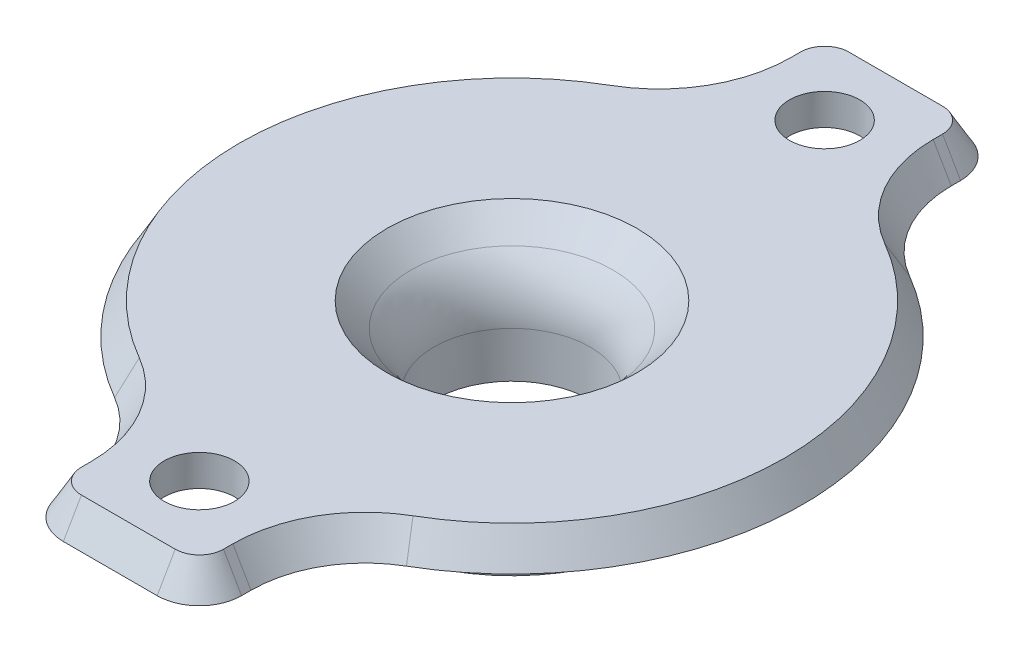
ISO-10303-21;
HEADER;
FILE_DESCRIPTION(('STEP AP214'),'2;1');
FILE_NAME('part.step','',(''),(''),'','','');
FILE_SCHEMA(('AUTOMOTIVE_DESIGN { 1 0 10303 214 1 1 1 1 }'));
ENDSEC;
DATA;
#1=APPLICATION_CONTEXT('core data for automotive mechanical design processes');
#2=APPLICATION_PROTOCOL_DEFINITION('international standard','automotive_design',2000,#1);
#3=PRODUCT_CONTEXT('',#1,'mechanical');
#4=PRODUCT('Part','Part','',(#3));
#5=PRODUCT_RELATED_PRODUCT_CATEGORY('part','',(#4));
#6=PRODUCT_DEFINITION_FORMATION('','',#4);
#7=PRODUCT_DEFINITION_CONTEXT('part definition',#1,'design');
#8=PRODUCT_DEFINITION('design','',#6,#7);
#9=PRODUCT_DEFINITION_SHAPE('','',#8);
#10=(LENGTH_UNIT() NAMED_UNIT(*) SI_UNIT(.MILLI.,.METRE.));
#11=(NAMED_UNIT(*) PLANE_ANGLE_UNIT() SI_UNIT($,.RADIAN.));
#12=(NAMED_UNIT(*) SI_UNIT($,.STERADIAN.) SOLID_ANGLE_UNIT());
#13=UNCERTAINTY_MEASURE_WITH_UNIT(LENGTH_MEASURE(1.E-05),#10,'distance_accuracy_value','');
#14=(GEOMETRIC_REPRESENTATION_CONTEXT(3) GLOBAL_UNCERTAINTY_ASSIGNED_CONTEXT((#13)) GLOBAL_UNIT_ASSIGNED_CONTEXT((#10,
#11,#12)) REPRESENTATION_CONTEXT('',''));
#15=CARTESIAN_POINT('',(0.,0.,0.));
#16=DIRECTION('',(0.,0.,1.));
#17=DIRECTION('',(1.,0.,0.));
#18=AXIS2_PLACEMENT_3D('',#15,#16,#17);
#19=CARTESIAN_POINT('',(-5.,2.,0.));
#20=DIRECTION('',(0.,1.,0.));
#21=DIRECTION('',(0.,0.,1.));
#22=AXIS2_PLACEMENT_3D('',#19,#20,#21);
#23=PLANE('',#22);
#24=CARTESIAN_POINT('',(0.,2.,0.));
#25=DIRECTION('',(0.,1.,0.));
#26=DIRECTION('',(0.,0.,1.));
#27=AXIS2_PLACEMENT_3D('',#24,#25,#26);
#28=CIRCLE('',#27,8.00000000000003);
#29=CARTESIAN_POINT('',(0.,2.,8.00000000000003));
#30=VERTEX_POINT('',#29);
#31=EDGE_CURVE('E235',#30,#30,#28,.F.);
#32=ORIENTED_EDGE('',*,*,#31,.T.);
#33=EDGE_LOOP('',(#32));
#34=FACE_BOUND('',#33,.T.);
#35=CARTESIAN_POINT('',(-3.,2.,23.));
#36=DIRECTION('',(0.,1.,0.));
#37=DIRECTION('',(0.,0.,1.));
#38=AXIS2_PLACEMENT_3D('',#35,#36,#37);
#39=CIRCLE('',#38,1.54529946162075);
#40=CARTESIAN_POINT('',(-4.54529946162075,2.,23.));
#41=VERTEX_POINT('',#40);
#42=CARTESIAN_POINT('',(-3.,2.,24.5452994616207));
#43=VERTEX_POINT('',#42);
#44=EDGE_CURVE('E67',#41,#43,#39,.T.);
#45=ORIENTED_EDGE('',*,*,#44,.T.);
#46=DIRECTION('',(1.,0.,0.));
#47=VECTOR('',#46,1.);
#48=CARTESIAN_POINT('',(-5.,2.,24.5452994616207));
#49=LINE('',#48,#47);
#50=CARTESIAN_POINT('',(3.,2.,24.5452994616207));
#51=VERTEX_POINT('',#50);
#52=EDGE_CURVE('E229',#43,#51,#49,.T.);
#53=ORIENTED_EDGE('',*,*,#52,.T.);
#54=CARTESIAN_POINT('',(3.,2.,23.));
#55=DIRECTION('',(0.,1.,0.));
#56=DIRECTION('',(0.,0.,1.));
#57=AXIS2_PLACEMENT_3D('',#54,#55,#56);
#58=CIRCLE('',#57,1.54529946162075);
#59=CARTESIAN_POINT('',(4.54529946162075,2.,23.));
#60=VERTEX_POINT('',#59);
#61=EDGE_CURVE('E226',#51,#60,#58,.T.);
#62=ORIENTED_EDGE('',*,*,#61,.T.);
#63=DIRECTION('',(0.,0.,-1.));
#64=VECTOR('',#63,1.);
#65=CARTESIAN_POINT('',(4.54529946162075,2.,22.401116043626));
#66=LINE('',#65,#64);
#67=CARTESIAN_POINT('',(4.54529946162075,2.,22.401116043626));
#68=VERTEX_POINT('',#67);
#69=EDGE_CURVE('E221',#60,#68,#66,.T.);
#70=ORIENTED_EDGE('',*,*,#69,.T.);
#71=CARTESIAN_POINT('',(13.,2.,22.401116043626));
#72=DIRECTION('',(0.,1.,0.));
#73=DIRECTION('',(0.,0.,1.));
#74=AXIS2_PLACEMENT_3D('',#71,#72,#73);
#75=CIRCLE('',#74,8.45470053837925);
#76=CARTESIAN_POINT('',(8.75632791509922,2.,15.08857828786));
#77=VERTEX_POINT('',#76);
#78=EDGE_CURVE('E222',#68,#77,#75,.F.);
#79=ORIENTED_EDGE('',*,*,#78,.T.);
#80=CARTESIAN_POINT('',(0.,2.,0.));
#81=DIRECTION('',(0.,1.,0.));
#82=DIRECTION('',(0.,0.,1.));
#83=AXIS2_PLACEMENT_3D('',#80,#81,#82);
#84=CIRCLE('',#83,17.4452994616207);
#85=CARTESIAN_POINT('',(8.75632791509922,2.,-15.08857828786));
#86=VERTEX_POINT('',#85);
#87=EDGE_CURVE('E178',#77,#86,#84,.T.);
#88=ORIENTED_EDGE('',*,*,#87,.T.);
#89=CARTESIAN_POINT('',(13.,2.,-22.401116043626));
#90=DIRECTION('',(0.,1.,0.));
#91=DIRECTION('',(0.,0.,1.));
#92=AXIS2_PLACEMENT_3D('',#89,#90,#91);
#93=CIRCLE('',#92,8.45470053837925);
#94=CARTESIAN_POINT('',(4.54529946162075,2.,-22.401116043626));
#95=VERTEX_POINT('',#94);
#96=EDGE_CURVE('E213',#86,#95,#93,.F.);
#97=ORIENTED_EDGE('',*,*,#96,.T.);
#98=DIRECTION('',(0.,0.,-1.));
#99=VECTOR('',#98,1.);
#100=CARTESIAN_POINT('',(4.54529946162075,2.,0.));
#101=LINE('',#100,#99);
#102=CARTESIAN_POINT('',(4.54529946162075,2.,-23.));
#103=VERTEX_POINT('',#102);
#104=EDGE_CURVE('E208',#95,#103,#101,.T.);
#105=ORIENTED_EDGE('',*,*,#104,.T.);
#106=CARTESIAN_POINT('',(3.,2.,-23.));
#107=DIRECTION('',(0.,1.,0.));
#108=DIRECTION('',(0.,0.,1.));
#109=AXIS2_PLACEMENT_3D('',#106,#107,#108);
#110=CIRCLE('',#109,1.54529946162075);
#111=CARTESIAN_POINT('',(3.,2.,-24.5452994616207));
#112=VERTEX_POINT('',#111);
#113=EDGE_CURVE('E207',#103,#112,#110,.T.);
#114=ORIENTED_EDGE('',*,*,#113,.T.);
#115=DIRECTION('',(-1.,0.,0.));
#116=VECTOR('',#115,1.);
#117=CARTESIAN_POINT('',(-5.,2.,-24.5452994616207));
#118=LINE('',#117,#116);
#119=CARTESIAN_POINT('',(-3.,2.,-24.5452994616207));
#120=VERTEX_POINT('',#119);
#121=EDGE_CURVE('E205',#112,#120,#118,.T.);
#122=ORIENTED_EDGE('',*,*,#121,.T.);
#123=CARTESIAN_POINT('',(-3.,2.,-23.));
#124=DIRECTION('',(0.,1.,0.));
#125=DIRECTION('',(0.,0.,1.));
#126=AXIS2_PLACEMENT_3D('',#123,#124,#125);
#127=CIRCLE('',#126,1.54529946162075);
#128=CARTESIAN_POINT('',(-4.54529946162075,2.,-23.));
#129=VERTEX_POINT('',#128);
#130=EDGE_CURVE('E204',#120,#129,#127,.T.);
#131=ORIENTED_EDGE('',*,*,#130,.T.);
#132=DIRECTION('',(0.,0.,1.));
#133=VECTOR('',#132,1.);
#134=CARTESIAN_POINT('',(-4.54529946162075,2.,-22.401116043626));
#135=LINE('',#134,#133);
#136=CARTESIAN_POINT('',(-4.54529946162075,2.,-22.401116043626));
#137=VERTEX_POINT('',#136);
#138=EDGE_CURVE('E206',#129,#137,#135,.T.);
#139=ORIENTED_EDGE('',*,*,#138,.T.);
#140=CARTESIAN_POINT('',(-13.,2.,-22.401116043626));
#141=DIRECTION('',(0.,1.,0.));
#142=DIRECTION('',(0.,0.,1.));
#143=AXIS2_PLACEMENT_3D('',#140,#141,#142);
#144=CIRCLE('',#143,8.45470053837925);
#145=CARTESIAN_POINT('',(-8.75632791509922,2.,-15.08857828786));
#146=VERTEX_POINT('',#145);
#147=EDGE_CURVE('E215',#137,#146,#144,.F.);
#148=ORIENTED_EDGE('',*,*,#147,.T.);
#149=CARTESIAN_POINT('',(0.,2.,0.));
#150=DIRECTION('',(0.,1.,0.));
#151=DIRECTION('',(0.,0.,1.));
#152=AXIS2_PLACEMENT_3D('',#149,#150,#151);
#153=CIRCLE('',#152,17.4452994616207);
#154=CARTESIAN_POINT('',(-8.75632791509922,2.,15.08857828786));
#155=VERTEX_POINT('',#154);
#156=EDGE_CURVE('E216',#146,#155,#153,.T.);
#157=ORIENTED_EDGE('',*,*,#156,.T.);
#158=CARTESIAN_POINT('',(-13.,2.,22.401116043626));
#159=DIRECTION('',(0.,1.,0.));
#160=DIRECTION('',(0.,0.,1.));
#161=AXIS2_PLACEMENT_3D('',#158,#159,#160);
#162=CIRCLE('',#161,8.45470053837925);
#163=CARTESIAN_POINT('',(-4.54529946162075,2.,22.401116043626));
#164=VERTEX_POINT('',#163);
#165=EDGE_CURVE('E218',#155,#164,#162,.F.);
#166=ORIENTED_EDGE('',*,*,#165,.T.);
#167=DIRECTION('',(0.,0.,1.));
#168=VECTOR('',#167,1.);
#169=CARTESIAN_POINT('',(-4.54529946162075,2.,0.));
#170=LINE('',#169,#168);
#171=EDGE_CURVE('E223',#164,#41,#170,.T.);
#172=ORIENTED_EDGE('',*,*,#171,.T.);
#173=EDGE_LOOP('',(#45,#53,#62,#70,#79,#88,#97,#105,#114,#122,#131,#139,#148,#157,#166,#172));
#174=FACE_BOUND('',#173,.T.);
#175=CARTESIAN_POINT('',(0.,2.,-20.));
#176=DIRECTION('',(0.,1.,0.));
#177=DIRECTION('',(0.,0.,1.));
#178=AXIS2_PLACEMENT_3D('',#175,#176,#177);
#179=CIRCLE('',#178,2.25);
#180=CARTESIAN_POINT('',(0.,2.,-17.75));
#181=VERTEX_POINT('',#180);
#182=EDGE_CURVE('E463',#181,#181,#179,.T.);
#183=ORIENTED_EDGE('',*,*,#182,.F.);
#184=EDGE_LOOP('',(#183));
#185=FACE_BOUND('',#184,.T.);
#186=CARTESIAN_POINT('',(0.,2.,20.));
#187=DIRECTION('',(0.,1.,0.));
#188=DIRECTION('',(0.,0.,1.));
#189=AXIS2_PLACEMENT_3D('',#186,#187,#188);
#190=CIRCLE('',#189,2.25);
#191=CARTESIAN_POINT('',(0.,2.,22.25));
#192=VERTEX_POINT('',#191);
#193=EDGE_CURVE('E472',#192,#192,#190,.F.);
#194=ORIENTED_EDGE('',*,*,#193,.T.);
#195=EDGE_LOOP('',(#194));
#196=FACE_BOUND('',#195,.T.);
#197=ADVANCED_FACE('F42',(#34,#174,#185,#196),#23,.T.);
#198=CARTESIAN_POINT('',(-18.6,0.,0.));
#199=DIRECTION('',(0.,-1.,0.));
#200=DIRECTION('',(0.,0.,-1.));
#201=AXIS2_PLACEMENT_3D('',#198,#199,#200);
#202=PLANE('',#201);
#203=CARTESIAN_POINT('',(0.,0.,0.));
#204=DIRECTION('',(0.,-1.,0.));
#205=DIRECTION('',(0.,0.,-1.));
#206=AXIS2_PLACEMENT_3D('',#203,#204,#205);
#207=CIRCLE('',#206,12.25);
#208=CARTESIAN_POINT('',(0.,0.,-12.25));
#209=VERTEX_POINT('',#208);
#210=EDGE_CURVE('E52',#209,#209,#207,.F.);
#211=ORIENTED_EDGE('',*,*,#210,.T.);
#212=EDGE_LOOP('',(#211));
#213=FACE_BOUND('',#212,.T.);
#214=CARTESIAN_POINT('',(0.,0.,20.));
#215=DIRECTION('',(0.,-1.,0.));
#216=DIRECTION('',(0.,0.,-1.));
#217=AXIS2_PLACEMENT_3D('',#214,#215,#216);
#218=CIRCLE('',#217,2.25);
#219=CARTESIAN_POINT('',(0.,0.,17.75));
#220=VERTEX_POINT('',#219);
#221=EDGE_CURVE('E476',#220,#220,#218,.T.);
#222=ORIENTED_EDGE('',*,*,#221,.F.);
#223=EDGE_LOOP('',(#222));
#224=FACE_BOUND('',#223,.T.);
#225=DIRECTION('',(0.,0.,-1.));
#226=VECTOR('',#225,1.);
#227=CARTESIAN_POINT('',(-5.7,0.,0.));
#228=LINE('',#227,#226);
#229=CARTESIAN_POINT('',(-5.7,0.,-22.401116043626));
#230=VERTEX_POINT('',#229);
#231=CARTESIAN_POINT('',(-5.7,0.,-23.));
#232=VERTEX_POINT('',#231);
#233=EDGE_CURVE('E433',#230,#232,#228,.T.);
#234=ORIENTED_EDGE('',*,*,#233,.T.);
#235=CARTESIAN_POINT('',(-3.,0.,-23.));
#236=DIRECTION('',(0.,-1.,0.));
#237=DIRECTION('',(0.,0.,-1.));
#238=AXIS2_PLACEMENT_3D('',#235,#236,#237);
#239=CIRCLE('',#238,2.7);
#240=CARTESIAN_POINT('',(-3.,0.,-25.7));
#241=VERTEX_POINT('',#240);
#242=EDGE_CURVE('E199',#232,#241,#239,.T.);
#243=ORIENTED_EDGE('',*,*,#242,.T.);
#244=DIRECTION('',(-1.,0.,0.));
#245=VECTOR('',#244,1.);
#246=CARTESIAN_POINT('',(0.,0.,-25.7));
#247=LINE('',#246,#245);
#248=CARTESIAN_POINT('',(3.,0.,-25.7));
#249=VERTEX_POINT('',#248);
#250=EDGE_CURVE('E458',#249,#241,#247,.T.);
#251=ORIENTED_EDGE('',*,*,#250,.F.);
#252=CARTESIAN_POINT('',(3.,0.,-23.));
#253=DIRECTION('',(0.,-1.,0.));
#254=DIRECTION('',(0.,0.,-1.));
#255=AXIS2_PLACEMENT_3D('',#252,#253,#254);
#256=CIRCLE('',#255,2.7);
#257=CARTESIAN_POINT('',(5.7,0.,-23.));
#258=VERTEX_POINT('',#257);
#259=EDGE_CURVE('E197',#249,#258,#256,.T.);
#260=ORIENTED_EDGE('',*,*,#259,.T.);
#261=DIRECTION('',(0.,0.,-1.));
#262=VECTOR('',#261,1.);
#263=CARTESIAN_POINT('',(5.7,0.,0.));
#264=LINE('',#263,#262);
#265=CARTESIAN_POINT('',(5.7,0.,-22.401116043626));
#266=VERTEX_POINT('',#265);
#267=EDGE_CURVE('E465',#266,#258,#264,.T.);
#268=ORIENTED_EDGE('',*,*,#267,.F.);
#269=CARTESIAN_POINT('',(13.,0.,-22.401116043626));
#270=DIRECTION('',(0.,-1.,0.));
#271=DIRECTION('',(0.,0.,-1.));
#272=AXIS2_PLACEMENT_3D('',#269,#270,#271);
#273=CIRCLE('',#272,7.3);
#274=CARTESIAN_POINT('',(9.33590733590734,0.,-16.0872879695538));
#275=VERTEX_POINT('',#274);
#276=EDGE_CURVE('E166',#266,#275,#273,.F.);
#277=ORIENTED_EDGE('',*,*,#276,.T.);
#278=CARTESIAN_POINT('',(0.,0.,0.));
#279=DIRECTION('',(0.,1.,0.));
#280=DIRECTION('',(0.,0.,1.));
#281=AXIS2_PLACEMENT_3D('',#278,#279,#280);
#282=CIRCLE('',#281,18.6);
#283=CARTESIAN_POINT('',(9.33590733590734,0.,16.0872879695538));
#284=VERTEX_POINT('',#283);
#285=EDGE_CURVE('E156',#284,#275,#282,.T.);
#286=ORIENTED_EDGE('',*,*,#285,.F.);
#287=CARTESIAN_POINT('',(13.,0.,22.401116043626));
#288=DIRECTION('',(0.,-1.,0.));
#289=DIRECTION('',(0.,0.,-1.));
#290=AXIS2_PLACEMENT_3D('',#287,#288,#289);
#291=CIRCLE('',#290,7.3);
#292=CARTESIAN_POINT('',(5.7,0.,22.401116043626));
#293=VERTEX_POINT('',#292);
#294=EDGE_CURVE('E164',#284,#293,#291,.F.);
#295=ORIENTED_EDGE('',*,*,#294,.T.);
#296=DIRECTION('',(0.,0.,1.));
#297=VECTOR('',#296,1.);
#298=CARTESIAN_POINT('',(5.7,0.,0.));
#299=LINE('',#298,#297);
#300=CARTESIAN_POINT('',(5.7,0.,23.));
#301=VERTEX_POINT('',#300);
#302=EDGE_CURVE('E266',#293,#301,#299,.T.);
#303=ORIENTED_EDGE('',*,*,#302,.T.);
#304=CARTESIAN_POINT('',(3.,0.,23.));
#305=DIRECTION('',(0.,-1.,0.));
#306=DIRECTION('',(0.,0.,-1.));
#307=AXIS2_PLACEMENT_3D('',#304,#305,#306);
#308=CIRCLE('',#307,2.7);
#309=CARTESIAN_POINT('',(3.,0.,25.7));
#310=VERTEX_POINT('',#309);
#311=EDGE_CURVE('E189',#301,#310,#308,.T.);
#312=ORIENTED_EDGE('',*,*,#311,.T.);
#313=DIRECTION('',(1.,0.,0.));
#314=VECTOR('',#313,1.);
#315=CARTESIAN_POINT('',(0.,0.,25.7));
#316=LINE('',#315,#314);
#317=CARTESIAN_POINT('',(-3.,0.,25.7));
#318=VERTEX_POINT('',#317);
#319=EDGE_CURVE('E466',#318,#310,#316,.T.);
#320=ORIENTED_EDGE('',*,*,#319,.F.);
#321=CARTESIAN_POINT('',(-3.,0.,23.));
#322=DIRECTION('',(0.,-1.,0.));
#323=DIRECTION('',(0.,0.,-1.));
#324=AXIS2_PLACEMENT_3D('',#321,#322,#323);
#325=CIRCLE('',#324,2.7);
#326=CARTESIAN_POINT('',(-5.7,0.,23.));
#327=VERTEX_POINT('',#326);
#328=EDGE_CURVE('E191',#318,#327,#325,.T.);
#329=ORIENTED_EDGE('',*,*,#328,.T.);
#330=DIRECTION('',(0.,0.,1.));
#331=VECTOR('',#330,1.);
#332=CARTESIAN_POINT('',(-5.7,0.,0.));
#333=LINE('',#332,#331);
#334=CARTESIAN_POINT('',(-5.7,0.,22.401116043626));
#335=VERTEX_POINT('',#334);
#336=EDGE_CURVE('E439',#335,#327,#333,.T.);
#337=ORIENTED_EDGE('',*,*,#336,.F.);
#338=CARTESIAN_POINT('',(-13.,0.,22.401116043626));
#339=DIRECTION('',(0.,-1.,0.));
#340=DIRECTION('',(0.,0.,-1.));
#341=AXIS2_PLACEMENT_3D('',#338,#339,#340);
#342=CIRCLE('',#341,7.3);
#343=CARTESIAN_POINT('',(-9.33590733590734,0.,16.0872879695538));
#344=VERTEX_POINT('',#343);
#345=EDGE_CURVE('E186',#335,#344,#342,.F.);
#346=ORIENTED_EDGE('',*,*,#345,.T.);
#347=CARTESIAN_POINT('',(-9.33590733590734,0.,-16.0872879695538));
#348=VERTEX_POINT('',#347);
#349=EDGE_CURVE('E175',#348,#344,#282,.T.);
#350=ORIENTED_EDGE('',*,*,#349,.F.);
#351=CARTESIAN_POINT('',(-13.,0.,-22.401116043626));
#352=DIRECTION('',(0.,-1.,0.));
#353=DIRECTION('',(0.,0.,-1.));
#354=AXIS2_PLACEMENT_3D('',#351,#352,#353);
#355=CIRCLE('',#354,7.3);
#356=EDGE_CURVE('E192',#348,#230,#355,.F.);
#357=ORIENTED_EDGE('',*,*,#356,.T.);
#358=EDGE_LOOP('',(#234,#243,#251,#260,#268,#277,#286,#295,#303,#312,#320,#329,#337,#346,#350,#357));
#359=FACE_BOUND('',#358,.T.);
#360=CARTESIAN_POINT('',(0.,0.,-20.));
#361=DIRECTION('',(0.,-1.,0.));
#362=DIRECTION('',(0.,0.,-1.));
#363=AXIS2_PLACEMENT_3D('',#360,#361,#362);
#364=CIRCLE('',#363,2.25);
#365=CARTESIAN_POINT('',(0.,0.,-22.25));
#366=VERTEX_POINT('',#365);
#367=EDGE_CURVE('E440',#366,#366,#364,.F.);
#368=ORIENTED_EDGE('',*,*,#367,.T.);
#369=EDGE_LOOP('',(#368));
#370=FACE_BOUND('',#369,.T.);
#371=ADVANCED_FACE('F162',(#213,#224,#359,#370),#202,.T.);
#372=CARTESIAN_POINT('',(0.,9.85860172324789,0.));
#373=DIRECTION('',(0.,1.,0.));
#374=DIRECTION('',(0.,0.,1.));
#375=AXIS2_PLACEMENT_3D('',#372,#373,#374);
#376=CYLINDRICAL_SURFACE('',#375,5.);
#377=CARTESIAN_POINT('',(0.,-3.07106781186551,0.));
#378=DIRECTION('',(0.,-1.,0.));
#379=DIRECTION('',(0.,0.,-1.));
#380=AXIS2_PLACEMENT_3D('',#377,#378,#379);
#381=CIRCLE('',#380,5.);
#382=CARTESIAN_POINT('',(0.,-3.07106781186551,-5.));
#383=VERTEX_POINT('',#382);
#384=EDGE_CURVE('E271',#383,#383,#381,.F.);
#385=ORIENTED_EDGE('',*,*,#384,.T.);
#386=EDGE_LOOP('',(#385));
#387=FACE_BOUND('',#386,.T.);
#388=CARTESIAN_POINT('',(0.,-6.,0.));
#389=DIRECTION('',(0.,1.,0.));
#390=DIRECTION('',(0.,0.,1.));
#391=AXIS2_PLACEMENT_3D('',#388,#389,#390);
#392=CIRCLE('',#391,5.);
#393=CARTESIAN_POINT('',(0.,-6.,5.));
#394=VERTEX_POINT('',#393);
#395=EDGE_CURVE('E427',#394,#394,#392,.T.);
#396=ORIENTED_EDGE('',*,*,#395,.F.);
#397=EDGE_LOOP('',(#396));
#398=FACE_BOUND('',#397,.T.);
#399=ADVANCED_FACE('F301',(#387,#398),#376,.F.);
#400=CARTESIAN_POINT('',(0.,9.85860172324789,0.));
#401=DIRECTION('',(0.,1.,0.));
#402=DIRECTION('',(0.,0.,1.));
#403=AXIS2_PLACEMENT_3D('',#400,#401,#402);
#404=CYLINDRICAL_SURFACE('',#403,10.25);
#405=CARTESIAN_POINT('',(0.,-1.99999999999999,0.));
#406=DIRECTION('',(0.,-1.,0.));
#407=DIRECTION('',(0.,0.,-1.));
#408=AXIS2_PLACEMENT_3D('',#405,#406,#407);
#409=CIRCLE('',#408,10.25);
#410=CARTESIAN_POINT('',(0.,-1.99999999999999,-10.25));
#411=VERTEX_POINT('',#410);
#412=EDGE_CURVE('E12',#411,#411,#409,.T.);
#413=ORIENTED_EDGE('',*,*,#412,.T.);
#414=EDGE_LOOP('',(#413));
#415=FACE_BOUND('',#414,.T.);
#416=CARTESIAN_POINT('',(0.,-6.,0.));
#417=DIRECTION('',(0.,1.,0.));
#418=DIRECTION('',(0.,0.,1.));
#419=AXIS2_PLACEMENT_3D('',#416,#417,#418);
#420=CIRCLE('',#419,10.25);
#421=CARTESIAN_POINT('',(0.,-6.,10.25));
#422=VERTEX_POINT('',#421);
#423=EDGE_CURVE('E435',#422,#422,#420,.T.);
#424=ORIENTED_EDGE('',*,*,#423,.T.);
#425=EDGE_LOOP('',(#424));
#426=FACE_BOUND('',#425,.T.);
#427=ADVANCED_FACE('F306',(#415,#426),#404,.T.);
#428=CARTESIAN_POINT('',(-10.25,-6.,0.));
#429=DIRECTION('',(0.,-1.,0.));
#430=DIRECTION('',(0.,0.,-1.));
#431=AXIS2_PLACEMENT_3D('',#428,#429,#430);
#432=PLANE('',#431);
#433=ORIENTED_EDGE('',*,*,#395,.T.);
#434=EDGE_LOOP('',(#433));
#435=FACE_BOUND('',#434,.T.);
#436=ORIENTED_EDGE('',*,*,#423,.F.);
#437=EDGE_LOOP('',(#436));
#438=FACE_BOUND('',#437,.T.);
#439=ADVANCED_FACE('F497',(#435,#438),#432,.T.);
#440=CARTESIAN_POINT('',(0.,-13.9240325192585,20.));
#441=DIRECTION('',(0.,1.,0.));
#442=DIRECTION('',(0.,0.,1.));
#443=AXIS2_PLACEMENT_3D('',#440,#441,#442);
#444=CYLINDRICAL_SURFACE('',#443,2.25);
#445=ORIENTED_EDGE('',*,*,#193,.F.);
#446=EDGE_LOOP('',(#445));
#447=FACE_BOUND('',#446,.T.);
#448=ORIENTED_EDGE('',*,*,#221,.T.);
#449=EDGE_LOOP('',(#448));
#450=FACE_BOUND('',#449,.T.);
#451=ADVANCED_FACE('F500',(#447,#450),#444,.F.);
#452=CARTESIAN_POINT('',(0.,-13.9240325192585,-20.));
#453=DIRECTION('',(0.,1.,0.));
#454=DIRECTION('',(0.,0.,1.));
#455=AXIS2_PLACEMENT_3D('',#452,#453,#454);
#456=CYLINDRICAL_SURFACE('',#455,2.25);
#457=ORIENTED_EDGE('',*,*,#182,.T.);
#458=EDGE_LOOP('',(#457));
#459=FACE_BOUND('',#458,.T.);
#460=ORIENTED_EDGE('',*,*,#367,.F.);
#461=EDGE_LOOP('',(#460));
#462=FACE_BOUND('',#461,.T.);
#463=ADVANCED_FACE('F413',(#459,#462),#456,.F.);
#464=CARTESIAN_POINT('',(-5.,2.,-24.5452994616207));
#465=DIRECTION('',(0.,-0.499999999999997,0.86602540378444));
#466=DIRECTION('',(-1.,0.,0.));
#467=AXIS2_PLACEMENT_3D('',#464,#465,#466);
#468=PLANE('',#467);
#469=DIRECTION('',(0.,0.86602540378444,0.499999999999997));
#470=VECTOR('',#469,1.);
#471=CARTESIAN_POINT('',(3.,0.,-25.7));
#472=LINE('',#471,#470);
#473=EDGE_CURVE('E263',#249,#112,#472,.T.);
#474=ORIENTED_EDGE('',*,*,#473,.F.);
#475=ORIENTED_EDGE('',*,*,#250,.T.);
#476=DIRECTION('',(0.,-0.86602540378444,-0.499999999999997));
#477=VECTOR('',#476,1.);
#478=CARTESIAN_POINT('',(-3.,2.,-24.5452994616207));
#479=LINE('',#478,#477);
#480=EDGE_CURVE('E270',#120,#241,#479,.T.);
#481=ORIENTED_EDGE('',*,*,#480,.F.);
#482=ORIENTED_EDGE('',*,*,#121,.F.);
#483=EDGE_LOOP('',(#474,#475,#481,#482));
#484=FACE_BOUND('',#483,.T.);
#485=ADVANCED_FACE('F407',(#484),#468,.F.);
#486=CARTESIAN_POINT('',(-3.,2.,-23.));
#487=DIRECTION('',(0.,-1.,0.));
#488=DIRECTION('',(0.,0.,-1.));
#489=AXIS2_PLACEMENT_3D('',#486,#487,#488);
#490=CONICAL_SURFACE('',#489,1.54529946162075,0.523598775598295);
#491=ORIENTED_EDGE('',*,*,#480,.T.);
#492=ORIENTED_EDGE('',*,*,#242,.F.);
#493=DIRECTION('',(-0.499999999999997,-0.86602540378444,0.));
#494=VECTOR('',#493,1.);
#495=CARTESIAN_POINT('',(-4.54529946162075,2.,-23.));
#496=LINE('',#495,#494);
#497=EDGE_CURVE('E261',#129,#232,#496,.T.);
#498=ORIENTED_EDGE('',*,*,#497,.F.);
#499=ORIENTED_EDGE('',*,*,#130,.F.);
#500=EDGE_LOOP('',(#491,#492,#498,#499));
#501=FACE_BOUND('',#500,.T.);
#502=ADVANCED_FACE('F402',(#501),#490,.T.);
#503=CARTESIAN_POINT('',(3.,2.,-23.));
#504=DIRECTION('',(0.,-1.,0.));
#505=DIRECTION('',(0.,0.,-1.));
#506=AXIS2_PLACEMENT_3D('',#503,#504,#505);
#507=CONICAL_SURFACE('',#506,1.54529946162075,0.523598775598296);
#508=ORIENTED_EDGE('',*,*,#473,.T.);
#509=ORIENTED_EDGE('',*,*,#113,.F.);
#510=DIRECTION('',(-0.499999999999997,0.86602540378444,0.));
#511=VECTOR('',#510,1.);
#512=CARTESIAN_POINT('',(5.7,0.,-23.));
#513=LINE('',#512,#511);
#514=EDGE_CURVE('E257',#258,#103,#513,.T.);
#515=ORIENTED_EDGE('',*,*,#514,.F.);
#516=ORIENTED_EDGE('',*,*,#259,.F.);
#517=EDGE_LOOP('',(#508,#509,#515,#516));
#518=FACE_BOUND('',#517,.T.);
#519=ADVANCED_FACE('F393',(#518),#507,.T.);
#520=CARTESIAN_POINT('',(-5.7,0.,0.));
#521=DIRECTION('',(-0.86602540378444,0.499999999999997,0.));
#522=DIRECTION('',(0.,0.,1.));
#523=AXIS2_PLACEMENT_3D('',#520,#521,#522);
#524=PLANE('',#523);
#525=ORIENTED_EDGE('',*,*,#497,.T.);
#526=ORIENTED_EDGE('',*,*,#233,.F.);
#527=DIRECTION('',(-0.499999999999997,-0.86602540378444,0.));
#528=VECTOR('',#527,1.);
#529=CARTESIAN_POINT('',(-4.54529946162075,2.,-22.401116043626));
#530=LINE('',#529,#528);
#531=EDGE_CURVE('E253',#137,#230,#530,.T.);
#532=ORIENTED_EDGE('',*,*,#531,.F.);
#533=ORIENTED_EDGE('',*,*,#138,.F.);
#534=EDGE_LOOP('',(#525,#526,#532,#533));
#535=FACE_BOUND('',#534,.T.);
#536=ADVANCED_FACE('F390',(#535),#524,.T.);
#537=CARTESIAN_POINT('',(4.54529946162075,2.,0.));
#538=DIRECTION('',(-0.86602540378444,-0.499999999999997,0.));
#539=DIRECTION('',(0.,0.,-1.));
#540=AXIS2_PLACEMENT_3D('',#537,#538,#539);
#541=PLANE('',#540);
#542=ORIENTED_EDGE('',*,*,#514,.T.);
#543=ORIENTED_EDGE('',*,*,#104,.F.);
#544=DIRECTION('',(-0.499999999999997,0.86602540378444,0.));
#545=VECTOR('',#544,1.);
#546=CARTESIAN_POINT('',(5.7,0.,-22.401116043626));
#547=LINE('',#546,#545);
#548=EDGE_CURVE('E255',#266,#95,#547,.T.);
#549=ORIENTED_EDGE('',*,*,#548,.F.);
#550=ORIENTED_EDGE('',*,*,#267,.T.);
#551=EDGE_LOOP('',(#542,#543,#549,#550));
#552=FACE_BOUND('',#551,.T.);
#553=ADVANCED_FACE('F379',(#552),#541,.F.);
#554=CARTESIAN_POINT('',(-13.,2.,-22.401116043626));
#555=DIRECTION('',(0.,1.,0.));
#556=DIRECTION('',(0.,0.,1.));
#557=AXIS2_PLACEMENT_3D('',#554,#555,#556);
#558=CONICAL_SURFACE('',#557,8.45470053837925,0.523598775598296);
#559=ORIENTED_EDGE('',*,*,#531,.T.);
#560=ORIENTED_EDGE('',*,*,#356,.F.);
#561=DIRECTION('',(-0.25096525096525,-0.86602540378444,-0.432453977676176));
#562=VECTOR('',#561,1.);
#563=CARTESIAN_POINT('',(-8.75632791509922,2.,-15.08857828786));
#564=LINE('',#563,#562);
#565=EDGE_CURVE('E248',#146,#348,#564,.T.);
#566=ORIENTED_EDGE('',*,*,#565,.F.);
#567=ORIENTED_EDGE('',*,*,#147,.F.);
#568=EDGE_LOOP('',(#559,#560,#566,#567));
#569=FACE_BOUND('',#568,.T.);
#570=ADVANCED_FACE('F373',(#569),#558,.F.);
#571=CARTESIAN_POINT('',(13.,2.,-22.401116043626));
#572=DIRECTION('',(0.,1.,0.));
#573=DIRECTION('',(0.,0.,1.));
#574=AXIS2_PLACEMENT_3D('',#571,#572,#573);
#575=CONICAL_SURFACE('',#574,8.45470053837925,0.523598775598296);
#576=ORIENTED_EDGE('',*,*,#548,.T.);
#577=ORIENTED_EDGE('',*,*,#96,.F.);
#578=DIRECTION('',(-0.25096525096525,0.86602540378444,0.432453977676175));
#579=VECTOR('',#578,1.);
#580=CARTESIAN_POINT('',(9.33590733590734,0.,-16.0872879695538));
#581=LINE('',#580,#579);
#582=EDGE_CURVE('E250',#275,#86,#581,.T.);
#583=ORIENTED_EDGE('',*,*,#582,.F.);
#584=ORIENTED_EDGE('',*,*,#276,.F.);
#585=EDGE_LOOP('',(#576,#577,#583,#584));
#586=FACE_BOUND('',#585,.T.);
#587=ADVANCED_FACE('F366',(#586),#575,.F.);
#588=CARTESIAN_POINT('',(0.,2.,0.));
#589=DIRECTION('',(0.,-1.,0.));
#590=DIRECTION('',(0.,0.,-1.));
#591=AXIS2_PLACEMENT_3D('',#588,#589,#590);
#592=CONICAL_SURFACE('',#591,17.4452994616207,0.523598775598296);
#593=ORIENTED_EDGE('',*,*,#565,.T.);
#594=ORIENTED_EDGE('',*,*,#349,.T.);
#595=DIRECTION('',(-0.25096525096525,-0.86602540378444,0.432453977676176));
#596=VECTOR('',#595,1.);
#597=CARTESIAN_POINT('',(-8.75632791509922,2.,15.08857828786));
#598=LINE('',#597,#596);
#599=EDGE_CURVE('E181',#155,#344,#598,.T.);
#600=ORIENTED_EDGE('',*,*,#599,.F.);
#601=ORIENTED_EDGE('',*,*,#156,.F.);
#602=EDGE_LOOP('',(#593,#594,#600,#601));
#603=FACE_BOUND('',#602,.T.);
#604=ADVANCED_FACE('F359',(#603),#592,.T.);
#605=CARTESIAN_POINT('',(0.,2.,0.));
#606=DIRECTION('',(0.,-1.,0.));
#607=DIRECTION('',(0.,0.,-1.));
#608=AXIS2_PLACEMENT_3D('',#605,#606,#607);
#609=CONICAL_SURFACE('',#608,17.4452994616207,0.523598775598296);
#610=ORIENTED_EDGE('',*,*,#582,.T.);
#611=ORIENTED_EDGE('',*,*,#87,.F.);
#612=DIRECTION('',(-0.25096525096525,0.86602540378444,-0.432453977676177));
#613=VECTOR('',#612,1.);
#614=CARTESIAN_POINT('',(9.33590733590734,0.,16.0872879695538));
#615=LINE('',#614,#613);
#616=EDGE_CURVE('E176',#284,#77,#615,.T.);
#617=ORIENTED_EDGE('',*,*,#616,.F.);
#618=ORIENTED_EDGE('',*,*,#285,.T.);
#619=EDGE_LOOP('',(#610,#611,#617,#618));
#620=FACE_BOUND('',#619,.T.);
#621=ADVANCED_FACE('F180',(#620),#609,.T.);
#622=CARTESIAN_POINT('',(-13.,2.,22.401116043626));
#623=DIRECTION('',(0.,1.,0.));
#624=DIRECTION('',(0.,0.,1.));
#625=AXIS2_PLACEMENT_3D('',#622,#623,#624);
#626=CONICAL_SURFACE('',#625,8.45470053837925,0.523598775598296);
#627=ORIENTED_EDGE('',*,*,#599,.T.);
#628=ORIENTED_EDGE('',*,*,#345,.F.);
#629=DIRECTION('',(-0.499999999999997,-0.86602540378444,0.));
#630=VECTOR('',#629,1.);
#631=CARTESIAN_POINT('',(-4.54529946162075,2.,22.401116043626));
#632=LINE('',#631,#630);
#633=EDGE_CURVE('E185',#164,#335,#632,.T.);
#634=ORIENTED_EDGE('',*,*,#633,.F.);
#635=ORIENTED_EDGE('',*,*,#165,.F.);
#636=EDGE_LOOP('',(#627,#628,#634,#635));
#637=FACE_BOUND('',#636,.T.);
#638=ADVANCED_FACE('F347',(#637),#626,.F.);
#639=CARTESIAN_POINT('',(13.,2.,22.401116043626));
#640=DIRECTION('',(0.,1.,0.));
#641=DIRECTION('',(0.,0.,1.));
#642=AXIS2_PLACEMENT_3D('',#639,#640,#641);
#643=CONICAL_SURFACE('',#642,8.45470053837925,0.523598775598296);
#644=ORIENTED_EDGE('',*,*,#616,.T.);
#645=ORIENTED_EDGE('',*,*,#78,.F.);
#646=DIRECTION('',(-0.499999999999997,0.86602540378444,0.));
#647=VECTOR('',#646,1.);
#648=CARTESIAN_POINT('',(5.7,0.,22.401116043626));
#649=LINE('',#648,#647);
#650=EDGE_CURVE('E187',#293,#68,#649,.T.);
#651=ORIENTED_EDGE('',*,*,#650,.F.);
#652=ORIENTED_EDGE('',*,*,#294,.F.);
#653=EDGE_LOOP('',(#644,#645,#651,#652));
#654=FACE_BOUND('',#653,.T.);
#655=ADVANCED_FACE('F183',(#654),#643,.F.);
#656=CARTESIAN_POINT('',(-4.54529946162075,2.,0.));
#657=DIRECTION('',(0.86602540378444,-0.499999999999997,0.));
#658=DIRECTION('',(0.,0.,1.));
#659=AXIS2_PLACEMENT_3D('',#656,#657,#658);
#660=PLANE('',#659);
#661=ORIENTED_EDGE('',*,*,#633,.T.);
#662=ORIENTED_EDGE('',*,*,#336,.T.);
#663=DIRECTION('',(-0.499999999999997,-0.86602540378444,0.));
#664=VECTOR('',#663,1.);
#665=CARTESIAN_POINT('',(-4.54529946162075,2.,23.));
#666=LINE('',#665,#664);
#667=EDGE_CURVE('E237',#41,#327,#666,.T.);
#668=ORIENTED_EDGE('',*,*,#667,.F.);
#669=ORIENTED_EDGE('',*,*,#171,.F.);
#670=EDGE_LOOP('',(#661,#662,#668,#669));
#671=FACE_BOUND('',#670,.T.);
#672=ADVANCED_FACE('F331',(#671),#660,.F.);
#673=CARTESIAN_POINT('',(5.7,0.,0.));
#674=DIRECTION('',(0.86602540378444,0.499999999999997,0.));
#675=DIRECTION('',(0.,0.,-1.));
#676=AXIS2_PLACEMENT_3D('',#673,#674,#675);
#677=PLANE('',#676);
#678=ORIENTED_EDGE('',*,*,#650,.T.);
#679=ORIENTED_EDGE('',*,*,#69,.F.);
#680=DIRECTION('',(-0.499999999999997,0.86602540378444,0.));
#681=VECTOR('',#680,1.);
#682=CARTESIAN_POINT('',(5.7,0.,23.));
#683=LINE('',#682,#681);
#684=EDGE_CURVE('E236',#301,#60,#683,.T.);
#685=ORIENTED_EDGE('',*,*,#684,.F.);
#686=ORIENTED_EDGE('',*,*,#302,.F.);
#687=EDGE_LOOP('',(#678,#679,#685,#686));
#688=FACE_BOUND('',#687,.T.);
#689=ADVANCED_FACE('F327',(#688),#677,.T.);
#690=CARTESIAN_POINT('',(-3.,2.,23.));
#691=DIRECTION('',(0.,-1.,0.));
#692=DIRECTION('',(0.,0.,-1.));
#693=AXIS2_PLACEMENT_3D('',#690,#691,#692);
#694=CONICAL_SURFACE('',#693,1.54529946162075,0.523598775598296);
#695=ORIENTED_EDGE('',*,*,#667,.T.);
#696=ORIENTED_EDGE('',*,*,#328,.F.);
#697=DIRECTION('',(0.,-0.86602540378444,0.499999999999997));
#698=VECTOR('',#697,1.);
#699=CARTESIAN_POINT('',(-3.,2.,24.5452994616207));
#700=LINE('',#699,#698);
#701=EDGE_CURVE('E234',#43,#318,#700,.T.);
#702=ORIENTED_EDGE('',*,*,#701,.F.);
#703=ORIENTED_EDGE('',*,*,#44,.F.);
#704=EDGE_LOOP('',(#695,#696,#702,#703));
#705=FACE_BOUND('',#704,.T.);
#706=ADVANCED_FACE('F321',(#705),#694,.T.);
#707=CARTESIAN_POINT('',(3.,2.,23.));
#708=DIRECTION('',(0.,-1.,0.));
#709=DIRECTION('',(0.,0.,-1.));
#710=AXIS2_PLACEMENT_3D('',#707,#708,#709);
#711=CONICAL_SURFACE('',#710,1.54529946162075,0.523598775598295);
#712=ORIENTED_EDGE('',*,*,#684,.T.);
#713=ORIENTED_EDGE('',*,*,#61,.F.);
#714=DIRECTION('',(0.,0.86602540378444,-0.499999999999997));
#715=VECTOR('',#714,1.);
#716=CARTESIAN_POINT('',(3.,0.,25.7));
#717=LINE('',#716,#715);
#718=EDGE_CURVE('E58',#310,#51,#717,.T.);
#719=ORIENTED_EDGE('',*,*,#718,.F.);
#720=ORIENTED_EDGE('',*,*,#311,.F.);
#721=EDGE_LOOP('',(#712,#713,#719,#720));
#722=FACE_BOUND('',#721,.T.);
#723=ADVANCED_FACE('F314',(#722),#711,.T.);
#724=CARTESIAN_POINT('',(-5.,2.,24.5452994616207));
#725=DIRECTION('',(0.,-0.499999999999997,-0.86602540378444));
#726=DIRECTION('',(1.,0.,0.));
#727=AXIS2_PLACEMENT_3D('',#724,#725,#726);
#728=PLANE('',#727);
#729=ORIENTED_EDGE('',*,*,#701,.T.);
#730=ORIENTED_EDGE('',*,*,#319,.T.);
#731=ORIENTED_EDGE('',*,*,#718,.T.);
#732=ORIENTED_EDGE('',*,*,#52,.F.);
#733=EDGE_LOOP('',(#729,#730,#731,#732));
#734=FACE_BOUND('',#733,.T.);
#735=ADVANCED_FACE('F307',(#734),#728,.F.);
#736=CARTESIAN_POINT('',(0.,-1.00000000000003,0.));
#737=DIRECTION('',(0.,1.,0.));
#738=DIRECTION('',(0.,0.,1.));
#739=AXIS2_PLACEMENT_3D('',#736,#737,#738);
#740=CONICAL_SURFACE('',#739,5.,0.785398163397449);
#741=CARTESIAN_POINT('',(0.,0.464466094067232,0.));
#742=DIRECTION('',(0.,-1.,0.));
#743=DIRECTION('',(0.,0.,-1.));
#744=AXIS2_PLACEMENT_3D('',#741,#742,#743);
#745=CIRCLE('',#744,6.46446609406726);
#746=CARTESIAN_POINT('',(0.,0.464466094067232,-6.46446609406726));
#747=VERTEX_POINT('',#746);
#748=EDGE_CURVE('E276',#747,#747,#745,.T.);
#749=ORIENTED_EDGE('',*,*,#748,.T.);
#750=EDGE_LOOP('',(#749));
#751=FACE_BOUND('',#750,.T.);
#752=ORIENTED_EDGE('',*,*,#31,.F.);
#753=EDGE_LOOP('',(#752));
#754=FACE_BOUND('',#753,.T.);
#755=ADVANCED_FACE('F286',(#751,#754),#740,.F.);
#756=CARTESIAN_POINT('',(0.,-3.07106781186551,0.));
#757=DIRECTION('',(0.,-1.,0.));
#758=DIRECTION('',(0.,0.,-1.));
#759=AXIS2_PLACEMENT_3D('',#756,#757,#758);
#760=TOROIDAL_SURFACE('',#759,10.,5.);
#761=ORIENTED_EDGE('',*,*,#748,.F.);
#762=EDGE_LOOP('',(#761));
#763=FACE_BOUND('',#762,.T.);
#764=ORIENTED_EDGE('',*,*,#384,.F.);
#765=EDGE_LOOP('',(#764));
#766=FACE_BOUND('',#765,.T.);
#767=ADVANCED_FACE('F283',(#763,#766),#760,.T.);
#768=CARTESIAN_POINT('',(0.,0.,0.));
#769=DIRECTION('',(0.,1.,0.));
#770=DIRECTION('',(0.,0.,1.));
#771=AXIS2_PLACEMENT_3D('',#768,#769,#770);
#772=CONICAL_SURFACE('',#771,12.25,0.785398163397453);
#773=ORIENTED_EDGE('',*,*,#412,.F.);
#774=EDGE_LOOP('',(#773));
#775=FACE_BOUND('',#774,.T.);
#776=ORIENTED_EDGE('',*,*,#210,.F.);
#777=EDGE_LOOP('',(#776));
#778=FACE_BOUND('',#777,.T.);
#779=ADVANCED_FACE('F50',(#775,#778),#772,.T.);
#780=CLOSED_SHELL('',(#197,#371,#399,#427,#439,#451,#463,#485,#502,#519,#536,#553,#570,#587,
#604,#621,#638,#655,#672,#689,#706,#723,#735,#755,#767,#779));
#781=MANIFOLD_SOLID_BREP('B2',#780);
#782=ADVANCED_BREP_SHAPE_REPRESENTATION('',(#18,#781),#14);
#783=SHAPE_DEFINITION_REPRESENTATION(#9,#782);
ENDSEC;
END-ISO-10303-21;
